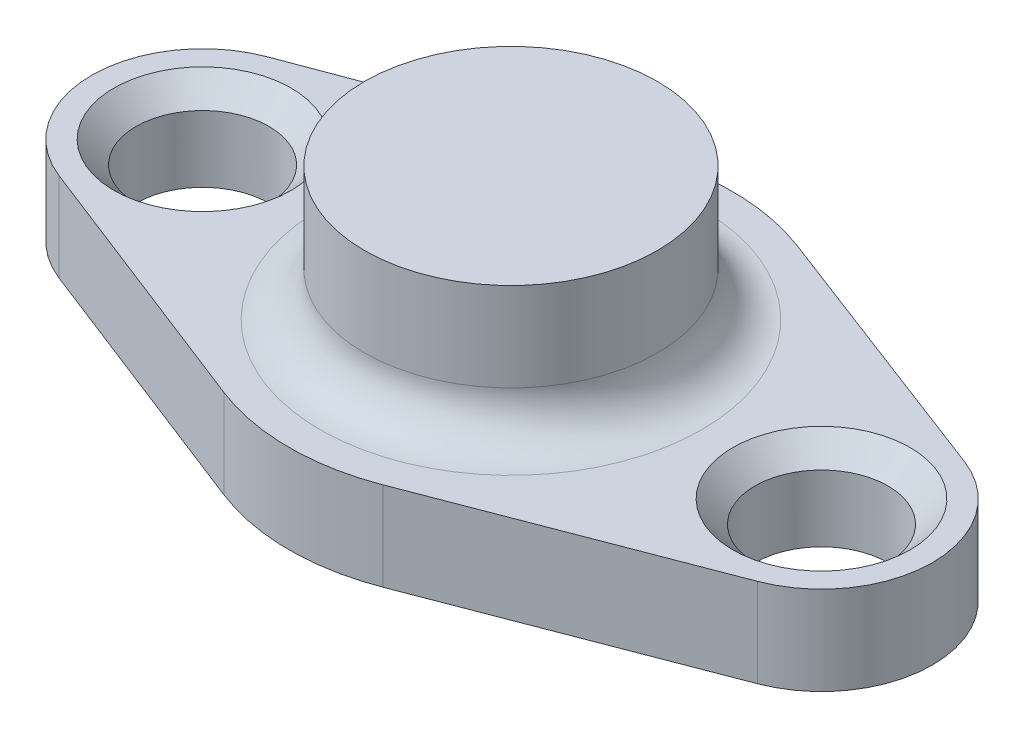
ISO-10303-21;
HEADER;
FILE_DESCRIPTION(('STEP AP214'),'2;1');
FILE_NAME('part.step','',(''),(''),'','','');
FILE_SCHEMA(('AUTOMOTIVE_DESIGN { 1 0 10303 214 1 1 1 1 }'));
ENDSEC;
DATA;
#1=APPLICATION_CONTEXT('core data for automotive mechanical design processes');
#2=APPLICATION_PROTOCOL_DEFINITION('international standard','automotive_design',2000,#1);
#3=PRODUCT_CONTEXT('',#1,'mechanical');
#4=PRODUCT('Part','Part','',(#3));
#5=PRODUCT_RELATED_PRODUCT_CATEGORY('part','',(#4));
#6=PRODUCT_DEFINITION_FORMATION('','',#4);
#7=PRODUCT_DEFINITION_CONTEXT('part definition',#1,'design');
#8=PRODUCT_DEFINITION('design','',#6,#7);
#9=PRODUCT_DEFINITION_SHAPE('','',#8);
#10=(LENGTH_UNIT() NAMED_UNIT(*) SI_UNIT(.MILLI.,.METRE.));
#11=(NAMED_UNIT(*) PLANE_ANGLE_UNIT() SI_UNIT($,.RADIAN.));
#12=(NAMED_UNIT(*) SI_UNIT($,.STERADIAN.) SOLID_ANGLE_UNIT());
#13=UNCERTAINTY_MEASURE_WITH_UNIT(LENGTH_MEASURE(1.E-05),#10,'distance_accuracy_value','');
#14=(GEOMETRIC_REPRESENTATION_CONTEXT(3) GLOBAL_UNCERTAINTY_ASSIGNED_CONTEXT((#13)) GLOBAL_UNIT_ASSIGNED_CONTEXT((#10,
#11,#12)) REPRESENTATION_CONTEXT('',''));
#15=CARTESIAN_POINT('',(0.,0.,0.));
#16=DIRECTION('',(0.,0.,1.));
#17=DIRECTION('',(1.,0.,0.));
#18=AXIS2_PLACEMENT_3D('',#15,#16,#17);
#19=CARTESIAN_POINT('',(69.9999921528156,-20.,-0.0331452222624423));
#20=DIRECTION('',(0.,1.,0.));
#21=DIRECTION('',(-1.,0.,0.));
#22=AXIS2_PLACEMENT_3D('',#19,#20,#21);
#23=CYLINDRICAL_SURFACE('',#22,25.);
#24=CARTESIAN_POINT('',(69.9999921528156,0.,-0.0331452222624423));
#25=DIRECTION('',(0.,-1.,0.));
#26=DIRECTION('',(1.,0.,0.));
#27=AXIS2_PLACEMENT_3D('',#24,#25,#26);
#28=CIRCLE('',#27,25.);
#29=CARTESIAN_POINT('',(78.9175056921311,0.,-23.3886146518441));
#30=VERTEX_POINT('',#29);
#31=CARTESIAN_POINT('',(78.9396194688102,0.,23.3138687934768));
#32=VERTEX_POINT('',#31);
#33=EDGE_CURVE('E142',#30,#32,#28,.T.);
#34=ORIENTED_EDGE('',*,*,#33,.T.);
#35=DIRECTION('',(0.,1.,0.));
#36=VECTOR('',#35,1.);
#37=CARTESIAN_POINT('',(78.9396194688102,-20.,23.3138687934768));
#38=LINE('',#37,#36);
#39=CARTESIAN_POINT('',(78.9396194688102,-20.,23.3138687934768));
#40=VERTEX_POINT('',#39);
#41=EDGE_CURVE('E184',#40,#32,#38,.T.);
#42=ORIENTED_EDGE('',*,*,#41,.F.);
#43=CARTESIAN_POINT('',(69.9999921528156,-20.,-0.0331452222624423));
#44=DIRECTION('',(0.,-1.,0.));
#45=DIRECTION('',(1.,0.,0.));
#46=AXIS2_PLACEMENT_3D('',#43,#44,#45);
#47=CIRCLE('',#46,25.);
#48=CARTESIAN_POINT('',(78.9175056921311,-20.,-23.3886146518441));
#49=VERTEX_POINT('',#48);
#50=EDGE_CURVE('E165',#49,#40,#47,.T.);
#51=ORIENTED_EDGE('',*,*,#50,.F.);
#52=DIRECTION('',(0.,1.,0.));
#53=VECTOR('',#52,1.);
#54=CARTESIAN_POINT('',(78.9175056921311,-20.,-23.3886146518441));
#55=LINE('',#54,#53);
#56=EDGE_CURVE('E138',#49,#30,#55,.T.);
#57=ORIENTED_EDGE('',*,*,#56,.T.);
#58=EDGE_LOOP('',(#34,#42,#51,#57));
#59=FACE_BOUND('',#58,.T.);
#60=ADVANCED_FACE('F39',(#59),#23,.T.);
#61=CARTESIAN_POINT('',(17.8792546319892,-20.,46.6940280314785));
#62=DIRECTION('',(-0.357585092639783,0.,-0.933880560629569));
#63=DIRECTION('',(-0.933880560629569,0.,0.357585092639783));
#64=AXIS2_PLACEMENT_3D('',#61,#62,#63);
#65=PLANE('',#64);
#66=DIRECTION('',(-0.933880560629569,0.,0.357585092639783));
#67=VECTOR('',#66,1.);
#68=CARTESIAN_POINT('',(17.8792546319892,0.,46.6940280314785));
#69=LINE('',#68,#67);
#70=CARTESIAN_POINT('',(17.8792546319892,0.,46.6940280314785));
#71=VERTEX_POINT('',#70);
#72=EDGE_CURVE('E146',#32,#71,#69,.T.);
#73=ORIENTED_EDGE('',*,*,#72,.T.);
#74=DIRECTION('',(0.,1.,0.));
#75=VECTOR('',#74,1.);
#76=CARTESIAN_POINT('',(17.8792546319892,-20.,46.6940280314785));
#77=LINE('',#76,#75);
#78=CARTESIAN_POINT('',(17.8792546319892,-20.,46.6940280314785));
#79=VERTEX_POINT('',#78);
#80=EDGE_CURVE('E180',#79,#71,#77,.T.);
#81=ORIENTED_EDGE('',*,*,#80,.F.);
#82=DIRECTION('',(-0.933880560629569,0.,0.357585092639783));
#83=VECTOR('',#82,1.);
#84=CARTESIAN_POINT('',(17.8792546319892,-20.,46.6940280314785));
#85=LINE('',#84,#83);
#86=EDGE_CURVE('E101',#40,#79,#85,.T.);
#87=ORIENTED_EDGE('',*,*,#86,.F.);
#88=ORIENTED_EDGE('',*,*,#41,.T.);
#89=EDGE_LOOP('',(#73,#81,#87,#88));
#90=FACE_BOUND('',#89,.T.);
#91=ADVANCED_FACE('F271',(#90),#65,.F.);
#92=CARTESIAN_POINT('',(0.,-20.,0.));
#93=DIRECTION('',(0.,1.,0.));
#94=DIRECTION('',(-1.,0.,0.));
#95=AXIS2_PLACEMENT_3D('',#92,#93,#94);
#96=CYLINDRICAL_SURFACE('',#95,50.);
#97=CARTESIAN_POINT('',(0.,0.,0.));
#98=DIRECTION('',(0.,-1.,0.));
#99=DIRECTION('',(1.,0.,0.));
#100=AXIS2_PLACEMENT_3D('',#97,#98,#99);
#101=CIRCLE('',#100,50.);
#102=CARTESIAN_POINT('',(-18.1568826975564,0.,46.5867750623198));
#103=VERTEX_POINT('',#102);
#104=EDGE_CURVE('E150',#71,#103,#101,.T.);
#105=ORIENTED_EDGE('',*,*,#104,.T.);
#106=DIRECTION('',(0.,1.,0.));
#107=VECTOR('',#106,1.);
#108=CARTESIAN_POINT('',(-18.1568826975564,-20.,46.5867750623198));
#109=LINE('',#108,#107);
#110=CARTESIAN_POINT('',(-18.1568826975564,-20.,46.5867750623198));
#111=VERTEX_POINT('',#110);
#112=EDGE_CURVE('E176',#111,#103,#109,.T.);
#113=ORIENTED_EDGE('',*,*,#112,.F.);
#114=CARTESIAN_POINT('',(0.,-20.,0.));
#115=DIRECTION('',(0.,-1.,0.));
#116=DIRECTION('',(1.,0.,0.));
#117=AXIS2_PLACEMENT_3D('',#114,#115,#116);
#118=CIRCLE('',#117,50.);
#119=EDGE_CURVE('E238',#79,#111,#118,.T.);
#120=ORIENTED_EDGE('',*,*,#119,.F.);
#121=ORIENTED_EDGE('',*,*,#80,.T.);
#122=EDGE_LOOP('',(#105,#113,#120,#121));
#123=FACE_BOUND('',#122,.T.);
#124=ADVANCED_FACE('F276',(#123),#96,.T.);
#125=CARTESIAN_POINT('',(-79.0769960781902,-20.,22.8435700198085));
#126=DIRECTION('',(0.363137653951129,0.,-0.931735501246395));
#127=DIRECTION('',(-0.931735501246395,0.,-0.363137653951129));
#128=AXIS2_PLACEMENT_3D('',#125,#126,#127);
#129=PLANE('',#128);
#130=DIRECTION('',(-0.931735501246395,0.,-0.363137653951129));
#131=VECTOR('',#130,1.);
#132=CARTESIAN_POINT('',(-79.0769960781902,0.,22.8435700198085));
#133=LINE('',#132,#131);
#134=CARTESIAN_POINT('',(-79.0769960781902,0.,22.8435700198086));
#135=VERTEX_POINT('',#134);
#136=EDGE_CURVE('E153',#103,#135,#133,.T.);
#137=ORIENTED_EDGE('',*,*,#136,.T.);
#138=DIRECTION('',(0.,1.,0.));
#139=VECTOR('',#138,1.);
#140=CARTESIAN_POINT('',(-79.0769960781902,-20.,22.8435700198086));
#141=LINE('',#140,#139);
#142=CARTESIAN_POINT('',(-79.0769960781902,-20.,22.8435700198086));
#143=VERTEX_POINT('',#142);
#144=EDGE_CURVE('E172',#143,#135,#141,.T.);
#145=ORIENTED_EDGE('',*,*,#144,.F.);
#146=DIRECTION('',(-0.931735501246395,0.,-0.363137653951129));
#147=VECTOR('',#146,1.);
#148=CARTESIAN_POINT('',(-79.0769960781902,-20.,22.8435700198085));
#149=LINE('',#148,#147);
#150=EDGE_CURVE('E241',#111,#143,#149,.T.);
#151=ORIENTED_EDGE('',*,*,#150,.F.);
#152=ORIENTED_EDGE('',*,*,#112,.T.);
#153=EDGE_LOOP('',(#137,#145,#151,#152));
#154=FACE_BOUND('',#153,.T.);
#155=ADVANCED_FACE('F249',(#154),#129,.F.);
#156=CARTESIAN_POINT('',(-69.998554729412,-20.,-0.449817511351326));
#157=DIRECTION('',(0.,1.,0.));
#158=DIRECTION('',(-1.,0.,0.));
#159=AXIS2_PLACEMENT_3D('',#156,#157,#158);
#160=CYLINDRICAL_SURFACE('',#159,25.);
#161=CARTESIAN_POINT('',(-69.998554729412,0.,-0.449817511351326));
#162=DIRECTION('',(0.,-1.,0.));
#163=DIRECTION('',(1.,0.,0.));
#164=AXIS2_PLACEMENT_3D('',#161,#162,#163);
#165=CIRCLE('',#164,25.);
#166=CARTESIAN_POINT('',(-78.7768875463001,0.,-23.8579544076519));
#167=VERTEX_POINT('',#166);
#168=EDGE_CURVE('E156',#135,#167,#165,.T.);
#169=ORIENTED_EDGE('',*,*,#168,.T.);
#170=DIRECTION('',(0.,1.,0.));
#171=VECTOR('',#170,1.);
#172=CARTESIAN_POINT('',(-78.7768875463001,-20.,-23.8579544076519));
#173=LINE('',#172,#171);
#174=CARTESIAN_POINT('',(-78.7768875463001,-20.,-23.8579544076519));
#175=VERTEX_POINT('',#174);
#176=EDGE_CURVE('E131',#175,#167,#173,.T.);
#177=ORIENTED_EDGE('',*,*,#176,.F.);
#178=CARTESIAN_POINT('',(-69.998554729412,-20.,-0.449817511351326));
#179=DIRECTION('',(0.,-1.,0.));
#180=DIRECTION('',(1.,0.,0.));
#181=AXIS2_PLACEMENT_3D('',#178,#179,#180);
#182=CIRCLE('',#181,25.);
#183=EDGE_CURVE('E120',#143,#175,#182,.T.);
#184=ORIENTED_EDGE('',*,*,#183,.F.);
#185=ORIENTED_EDGE('',*,*,#144,.T.);
#186=EDGE_LOOP('',(#169,#177,#184,#185));
#187=FACE_BOUND('',#186,.T.);
#188=ADVANCED_FACE('F253',(#187),#160,.T.);
#189=CARTESIAN_POINT('',(-17.5566656337762,-20.,-46.8162737926011));
#190=DIRECTION('',(0.351133312675524,0.,0.93632547585202));
#191=DIRECTION('',(0.93632547585202,0.,-0.351133312675524));
#192=AXIS2_PLACEMENT_3D('',#189,#190,#191);
#193=PLANE('',#192);
#194=DIRECTION('',(0.93632547585202,0.,-0.351133312675524));
#195=VECTOR('',#194,1.);
#196=CARTESIAN_POINT('',(-17.5566656337762,0.,-46.8162737926011));
#197=LINE('',#196,#195);
#198=CARTESIAN_POINT('',(-17.5566656337762,0.,-46.816273792601));
#199=VERTEX_POINT('',#198);
#200=EDGE_CURVE('E129',#167,#199,#197,.T.);
#201=ORIENTED_EDGE('',*,*,#200,.T.);
#202=DIRECTION('',(0.,1.,0.));
#203=VECTOR('',#202,1.);
#204=CARTESIAN_POINT('',(-17.5566656337762,-20.,-46.816273792601));
#205=LINE('',#204,#203);
#206=CARTESIAN_POINT('',(-17.5566656337762,-20.,-46.816273792601));
#207=VERTEX_POINT('',#206);
#208=EDGE_CURVE('E126',#207,#199,#205,.T.);
#209=ORIENTED_EDGE('',*,*,#208,.F.);
#210=DIRECTION('',(0.93632547585202,0.,-0.351133312675524));
#211=VECTOR('',#210,1.);
#212=CARTESIAN_POINT('',(-17.5566656337762,-20.,-46.8162737926011));
#213=LINE('',#212,#211);
#214=EDGE_CURVE('E114',#175,#207,#213,.T.);
#215=ORIENTED_EDGE('',*,*,#214,.F.);
#216=ORIENTED_EDGE('',*,*,#176,.T.);
#217=EDGE_LOOP('',(#201,#209,#215,#216));
#218=FACE_BOUND('',#217,.T.);
#219=ADVANCED_FACE('F127',(#218),#193,.F.);
#220=CARTESIAN_POINT('',(0.,-20.,0.));
#221=DIRECTION('',(0.,1.,0.));
#222=DIRECTION('',(-1.,0.,0.));
#223=AXIS2_PLACEMENT_3D('',#220,#221,#222);
#224=CYLINDRICAL_SURFACE('',#223,50.);
#225=CARTESIAN_POINT('',(0.,0.,0.));
#226=DIRECTION('',(0.,-1.,0.));
#227=DIRECTION('',(1.,0.,0.));
#228=AXIS2_PLACEMENT_3D('',#225,#226,#227);
#229=CIRCLE('',#228,50.);
#230=CARTESIAN_POINT('',(17.835027078631,0.,-46.7109388591634));
#231=VERTEX_POINT('',#230);
#232=EDGE_CURVE('E86',#199,#231,#229,.T.);
#233=ORIENTED_EDGE('',*,*,#232,.T.);
#234=DIRECTION('',(0.,1.,0.));
#235=VECTOR('',#234,1.);
#236=CARTESIAN_POINT('',(17.835027078631,-20.,-46.7109388591634));
#237=LINE('',#236,#235);
#238=CARTESIAN_POINT('',(17.835027078631,-20.,-46.7109388591634));
#239=VERTEX_POINT('',#238);
#240=EDGE_CURVE('E132',#239,#231,#237,.T.);
#241=ORIENTED_EDGE('',*,*,#240,.F.);
#242=CARTESIAN_POINT('',(0.,-20.,0.));
#243=DIRECTION('',(0.,-1.,0.));
#244=DIRECTION('',(1.,0.,0.));
#245=AXIS2_PLACEMENT_3D('',#242,#243,#244);
#246=CIRCLE('',#245,50.);
#247=EDGE_CURVE('E118',#207,#239,#246,.T.);
#248=ORIENTED_EDGE('',*,*,#247,.F.);
#249=ORIENTED_EDGE('',*,*,#208,.T.);
#250=EDGE_LOOP('',(#233,#241,#248,#249));
#251=FACE_BOUND('',#250,.T.);
#252=ADVANCED_FACE('F134',(#251),#224,.T.);
#253=CARTESIAN_POINT('',(78.9175056921311,-20.,-23.3886146518441));
#254=DIRECTION('',(-0.356700541572621,0.,0.934218777183267));
#255=DIRECTION('',(0.934218777183267,0.,0.356700541572621));
#256=AXIS2_PLACEMENT_3D('',#253,#254,#255);
#257=PLANE('',#256);
#258=DIRECTION('',(0.934218777183267,0.,0.356700541572621));
#259=VECTOR('',#258,1.);
#260=CARTESIAN_POINT('',(78.9175056921311,0.,-23.3886146518441));
#261=LINE('',#260,#259);
#262=EDGE_CURVE('E92',#231,#30,#261,.T.);
#263=ORIENTED_EDGE('',*,*,#262,.T.);
#264=ORIENTED_EDGE('',*,*,#56,.F.);
#265=DIRECTION('',(0.934218777183267,0.,0.356700541572621));
#266=VECTOR('',#265,1.);
#267=CARTESIAN_POINT('',(78.9175056921311,-20.,-23.3886146518441));
#268=LINE('',#267,#266);
#269=EDGE_CURVE('E57',#239,#49,#268,.T.);
#270=ORIENTED_EDGE('',*,*,#269,.F.);
#271=ORIENTED_EDGE('',*,*,#240,.T.);
#272=EDGE_LOOP('',(#263,#264,#270,#271));
#273=FACE_BOUND('',#272,.T.);
#274=ADVANCED_FACE('F260',(#273),#257,.F.);
#275=CARTESIAN_POINT('',(69.9999921528156,-20.,-0.0331452222624423));
#276=DIRECTION('',(0.,-1.,0.));
#277=DIRECTION('',(1.,0.,0.));
#278=AXIS2_PLACEMENT_3D('',#275,#276,#277);
#279=PLANE('',#278);
#280=CARTESIAN_POINT('',(-69.998554729412,-20.,-0.449817511351326));
#281=DIRECTION('',(0.,1.,0.));
#282=DIRECTION('',(-1.,0.,0.));
#283=AXIS2_PLACEMENT_3D('',#280,#281,#282);
#284=CIRCLE('',#283,15.);
#285=CARTESIAN_POINT('',(-84.998554729412,-20.,-0.449817511351326));
#286=VERTEX_POINT('',#285);
#287=EDGE_CURVE('E222',#286,#286,#284,.T.);
#288=ORIENTED_EDGE('',*,*,#287,.T.);
#289=EDGE_LOOP('',(#288));
#290=FACE_BOUND('',#289,.T.);
#291=CARTESIAN_POINT('',(69.9999921528156,-20.,-0.0331452222624423));
#292=DIRECTION('',(0.,1.,0.));
#293=DIRECTION('',(-1.,0.,0.));
#294=AXIS2_PLACEMENT_3D('',#291,#292,#293);
#295=CIRCLE('',#294,15.);
#296=CARTESIAN_POINT('',(54.9999921528156,-20.,-0.0331452222624423));
#297=VERTEX_POINT('',#296);
#298=EDGE_CURVE('E225',#297,#297,#295,.T.);
#299=ORIENTED_EDGE('',*,*,#298,.T.);
#300=EDGE_LOOP('',(#299));
#301=FACE_BOUND('',#300,.T.);
#302=ORIENTED_EDGE('',*,*,#50,.T.);
#303=ORIENTED_EDGE('',*,*,#86,.T.);
#304=ORIENTED_EDGE('',*,*,#119,.T.);
#305=ORIENTED_EDGE('',*,*,#150,.T.);
#306=ORIENTED_EDGE('',*,*,#183,.T.);
#307=ORIENTED_EDGE('',*,*,#214,.T.);
#308=ORIENTED_EDGE('',*,*,#247,.T.);
#309=ORIENTED_EDGE('',*,*,#269,.T.);
#310=EDGE_LOOP('',(#302,#303,#304,#305,#306,#307,#308,#309));
#311=FACE_BOUND('',#310,.T.);
#312=ADVANCED_FACE('F116',(#290,#301,#311),#279,.T.);
#313=CARTESIAN_POINT('',(69.9999921528156,0.,-0.0331452222624423));
#314=DIRECTION('',(0.,-1.,0.));
#315=DIRECTION('',(1.,0.,0.));
#316=AXIS2_PLACEMENT_3D('',#313,#314,#315);
#317=PLANE('',#316);
#318=CARTESIAN_POINT('',(-69.998554729412,0.,-0.449817511351326));
#319=DIRECTION('',(0.,-1.,0.));
#320=DIRECTION('',(1.,0.,0.));
#321=AXIS2_PLACEMENT_3D('',#318,#319,#320);
#322=CIRCLE('',#321,20.);
#323=CARTESIAN_POINT('',(-49.9985547294119,0.,-0.449817511351326));
#324=VERTEX_POINT('',#323);
#325=EDGE_CURVE('E49',#324,#324,#322,.T.);
#326=ORIENTED_EDGE('',*,*,#325,.T.);
#327=EDGE_LOOP('',(#326));
#328=FACE_BOUND('',#327,.T.);
#329=CARTESIAN_POINT('',(69.9999921528156,0.,-0.0331452222624423));
#330=DIRECTION('',(0.,-1.,0.));
#331=DIRECTION('',(1.,0.,0.));
#332=AXIS2_PLACEMENT_3D('',#329,#330,#331);
#333=CIRCLE('',#332,20.);
#334=CARTESIAN_POINT('',(89.9999921528156,0.,-0.0331452222624423));
#335=VERTEX_POINT('',#334);
#336=EDGE_CURVE('E199',#335,#335,#333,.T.);
#337=ORIENTED_EDGE('',*,*,#336,.T.);
#338=EDGE_LOOP('',(#337));
#339=FACE_BOUND('',#338,.T.);
#340=CARTESIAN_POINT('',(0.,0.,0.));
#341=DIRECTION('',(0.,-1.,0.));
#342=DIRECTION('',(1.,0.,0.));
#343=AXIS2_PLACEMENT_3D('',#340,#341,#342);
#344=CIRCLE('',#343,43.0333205011068);
#345=CARTESIAN_POINT('',(43.0333205011068,0.,0.));
#346=VERTEX_POINT('',#345);
#347=EDGE_CURVE('E191',#346,#346,#344,.T.);
#348=ORIENTED_EDGE('',*,*,#347,.T.);
#349=EDGE_LOOP('',(#348));
#350=FACE_BOUND('',#349,.T.);
#351=ORIENTED_EDGE('',*,*,#33,.F.);
#352=ORIENTED_EDGE('',*,*,#262,.F.);
#353=ORIENTED_EDGE('',*,*,#232,.F.);
#354=ORIENTED_EDGE('',*,*,#200,.F.);
#355=ORIENTED_EDGE('',*,*,#168,.F.);
#356=ORIENTED_EDGE('',*,*,#136,.F.);
#357=ORIENTED_EDGE('',*,*,#104,.F.);
#358=ORIENTED_EDGE('',*,*,#72,.F.);
#359=EDGE_LOOP('',(#351,#352,#353,#354,#355,#356,#357,#358));
#360=FACE_BOUND('',#359,.T.);
#361=ADVANCED_FACE('F206',(#328,#339,#350,#360),#317,.F.);
#362=CARTESIAN_POINT('',(0.,30.,0.));
#363=DIRECTION('',(0.,-1.,0.));
#364=DIRECTION('',(1.,0.,0.));
#365=AXIS2_PLACEMENT_3D('',#362,#363,#364);
#366=CYLINDRICAL_SURFACE('',#365,33.0333205011068);
#367=CARTESIAN_POINT('',(0.,10.,0.));
#368=DIRECTION('',(0.,-1.,0.));
#369=DIRECTION('',(1.,0.,0.));
#370=AXIS2_PLACEMENT_3D('',#367,#368,#369);
#371=CIRCLE('',#370,33.0333205011068);
#372=CARTESIAN_POINT('',(33.0333205011068,10.,0.));
#373=VERTEX_POINT('',#372);
#374=EDGE_CURVE('E187',#373,#373,#371,.F.);
#375=ORIENTED_EDGE('',*,*,#374,.T.);
#376=EDGE_LOOP('',(#375));
#377=FACE_BOUND('',#376,.T.);
#378=CARTESIAN_POINT('',(0.,30.,0.));
#379=DIRECTION('',(0.,1.,0.));
#380=DIRECTION('',(-1.,0.,0.));
#381=AXIS2_PLACEMENT_3D('',#378,#379,#380);
#382=CIRCLE('',#381,33.0333205011068);
#383=CARTESIAN_POINT('',(-33.0333205011068,30.,0.));
#384=VERTEX_POINT('',#383);
#385=EDGE_CURVE('E147',#384,#384,#382,.T.);
#386=ORIENTED_EDGE('',*,*,#385,.F.);
#387=EDGE_LOOP('',(#386));
#388=FACE_BOUND('',#387,.T.);
#389=ADVANCED_FACE('F288',(#377,#388),#366,.T.);
#390=CARTESIAN_POINT('',(0.,30.,0.));
#391=DIRECTION('',(0.,1.,0.));
#392=DIRECTION('',(-1.,0.,0.));
#393=AXIS2_PLACEMENT_3D('',#390,#391,#392);
#394=PLANE('',#393);
#395=ORIENTED_EDGE('',*,*,#385,.T.);
#396=EDGE_LOOP('',(#395));
#397=FACE_BOUND('',#396,.T.);
#398=ADVANCED_FACE('F291',(#397),#394,.T.);
#399=CARTESIAN_POINT('',(69.9999921528156,-20.,-0.0331452222624423));
#400=DIRECTION('',(0.,1.,0.));
#401=DIRECTION('',(-1.,0.,0.));
#402=AXIS2_PLACEMENT_3D('',#399,#400,#401);
#403=CYLINDRICAL_SURFACE('',#402,15.);
#404=CARTESIAN_POINT('',(69.9999921528156,-5.00000000000008,-0.0331452222624423));
#405=DIRECTION('',(0.,-1.,0.));
#406=DIRECTION('',(0.,0.,-1.));
#407=AXIS2_PLACEMENT_3D('',#404,#405,#406);
#408=CIRCLE('',#407,15.);
#409=CARTESIAN_POINT('',(69.9999921528156,-5.00000000000008,-15.0331452222624));
#410=VERTEX_POINT('',#409);
#411=EDGE_CURVE('E11',#410,#410,#408,.F.);
#412=ORIENTED_EDGE('',*,*,#411,.T.);
#413=EDGE_LOOP('',(#412));
#414=FACE_BOUND('',#413,.T.);
#415=ORIENTED_EDGE('',*,*,#298,.F.);
#416=EDGE_LOOP('',(#415));
#417=FACE_BOUND('',#416,.T.);
#418=ADVANCED_FACE('F218',(#414,#417),#403,.F.);
#419=CARTESIAN_POINT('',(-69.998554729412,-20.,-0.449817511351326));
#420=DIRECTION('',(0.,1.,0.));
#421=DIRECTION('',(-1.,0.,0.));
#422=AXIS2_PLACEMENT_3D('',#419,#420,#421);
#423=CYLINDRICAL_SURFACE('',#422,15.);
#424=CARTESIAN_POINT('',(-69.998554729412,-5.0000000000001,-0.449817511351326));
#425=DIRECTION('',(0.,-1.,0.));
#426=DIRECTION('',(0.,0.,-1.));
#427=AXIS2_PLACEMENT_3D('',#424,#425,#426);
#428=CIRCLE('',#427,15.);
#429=CARTESIAN_POINT('',(-69.998554729412,-5.0000000000001,-15.4498175113513));
#430=VERTEX_POINT('',#429);
#431=EDGE_CURVE('E195',#430,#430,#428,.F.);
#432=ORIENTED_EDGE('',*,*,#431,.T.);
#433=EDGE_LOOP('',(#432));
#434=FACE_BOUND('',#433,.T.);
#435=ORIENTED_EDGE('',*,*,#287,.F.);
#436=EDGE_LOOP('',(#435));
#437=FACE_BOUND('',#436,.T.);
#438=ADVANCED_FACE('F215',(#434,#437),#423,.F.);
#439=CARTESIAN_POINT('',(0.,10.,0.));
#440=DIRECTION('',(0.,-1.,0.));
#441=DIRECTION('',(1.,0.,0.));
#442=AXIS2_PLACEMENT_3D('',#439,#440,#441);
#443=TOROIDAL_SURFACE('',#442,43.0333205011068,10.);
#444=ORIENTED_EDGE('',*,*,#347,.F.);
#445=EDGE_LOOP('',(#444));
#446=FACE_BOUND('',#445,.T.);
#447=ORIENTED_EDGE('',*,*,#374,.F.);
#448=EDGE_LOOP('',(#447));
#449=FACE_BOUND('',#448,.T.);
#450=ADVANCED_FACE('F212',(#446,#449),#443,.F.);
#451=CARTESIAN_POINT('',(-69.998554729412,-5.0000000000001,-0.449817511351326));
#452=DIRECTION('',(0.,1.,0.));
#453=DIRECTION('',(0.,0.,1.));
#454=AXIS2_PLACEMENT_3D('',#451,#452,#453);
#455=CONICAL_SURFACE('',#454,15.,0.785398163397443);
#456=ORIENTED_EDGE('',*,*,#325,.F.);
#457=EDGE_LOOP('',(#456));
#458=FACE_BOUND('',#457,.T.);
#459=ORIENTED_EDGE('',*,*,#431,.F.);
#460=EDGE_LOOP('',(#459));
#461=FACE_BOUND('',#460,.T.);
#462=ADVANCED_FACE('F209',(#458,#461),#455,.F.);
#463=CARTESIAN_POINT('',(69.9999921528156,-5.00000000000008,-0.0331452222624423));
#464=DIRECTION('',(0.,1.,0.));
#465=DIRECTION('',(0.,0.,1.));
#466=AXIS2_PLACEMENT_3D('',#463,#464,#465);
#467=CONICAL_SURFACE('',#466,15.,0.785398163397443);
#468=ORIENTED_EDGE('',*,*,#336,.F.);
#469=EDGE_LOOP('',(#468));
#470=FACE_BOUND('',#469,.T.);
#471=ORIENTED_EDGE('',*,*,#411,.F.);
#472=EDGE_LOOP('',(#471));
#473=FACE_BOUND('',#472,.T.);
#474=ADVANCED_FACE('F41',(#470,#473),#467,.F.);
#475=CLOSED_SHELL('',(#60,#91,#124,#155,#188,#219,#252,#274,#312,#361,#389,#398,#418,#438,#450,
#462,#474));
#476=MANIFOLD_SOLID_BREP('B2',#475);
#477=ADVANCED_BREP_SHAPE_REPRESENTATION('',(#18,#476),#14);
#478=SHAPE_DEFINITION_REPRESENTATION(#9,#477);
ENDSEC;
END-ISO-10303-21;
